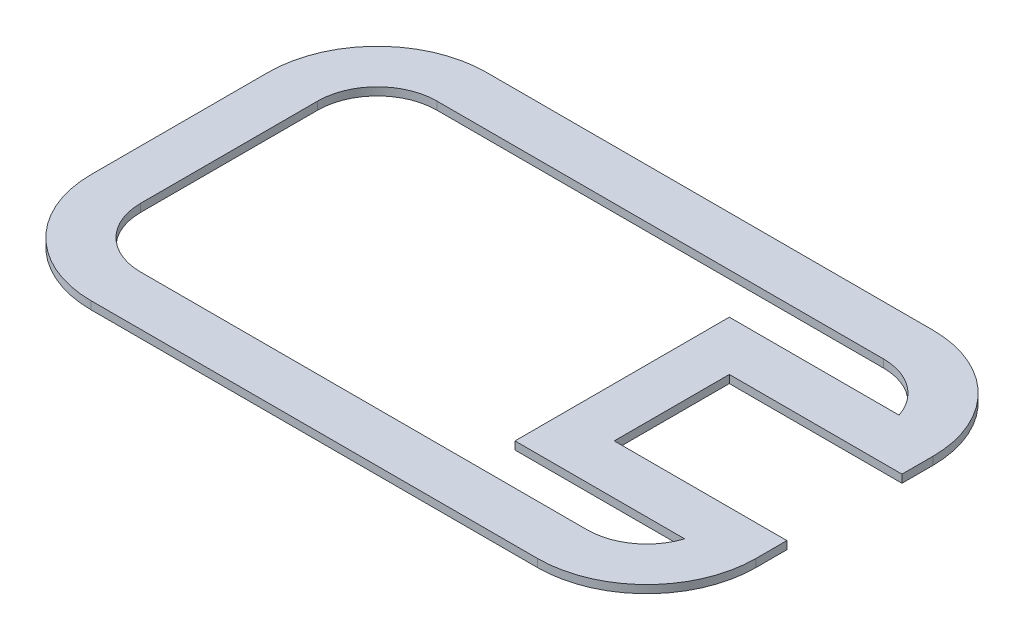
ISO-10303-21;
HEADER;
FILE_DESCRIPTION(('STEP AP214'),'2;1');
FILE_NAME('part.step','',(''),(''),'','','');
FILE_SCHEMA(('AUTOMOTIVE_DESIGN { 1 0 10303 214 1 1 1 1 }'));
ENDSEC;
DATA;
#1=APPLICATION_CONTEXT('core data for automotive mechanical design processes');
#2=APPLICATION_PROTOCOL_DEFINITION('international standard','automotive_design',2000,#1);
#3=PRODUCT_CONTEXT('',#1,'mechanical');
#4=PRODUCT('Part','Part','',(#3));
#5=PRODUCT_RELATED_PRODUCT_CATEGORY('part','',(#4));
#6=PRODUCT_DEFINITION_FORMATION('','',#4);
#7=PRODUCT_DEFINITION_CONTEXT('part definition',#1,'design');
#8=PRODUCT_DEFINITION('design','',#6,#7);
#9=PRODUCT_DEFINITION_SHAPE('','',#8);
#10=(LENGTH_UNIT() NAMED_UNIT(*) SI_UNIT(.MILLI.,.METRE.));
#11=(NAMED_UNIT(*) PLANE_ANGLE_UNIT() SI_UNIT($,.RADIAN.));
#12=(NAMED_UNIT(*) SI_UNIT($,.STERADIAN.) SOLID_ANGLE_UNIT());
#13=UNCERTAINTY_MEASURE_WITH_UNIT(LENGTH_MEASURE(1.E-05),#10,'distance_accuracy_value','');
#14=(GEOMETRIC_REPRESENTATION_CONTEXT(3) GLOBAL_UNCERTAINTY_ASSIGNED_CONTEXT((#13)) GLOBAL_UNIT_ASSIGNED_CONTEXT((#10,
#11,#12)) REPRESENTATION_CONTEXT('',''));
#15=CARTESIAN_POINT('',(0.,0.,0.));
#16=DIRECTION('',(0.,0.,1.));
#17=DIRECTION('',(1.,0.,0.));
#18=AXIS2_PLACEMENT_3D('',#15,#16,#17);
#19=CARTESIAN_POINT('',(1.96231369162959,4.,121.411584964041));
#20=DIRECTION('',(0.,1.,0.));
#21=DIRECTION('',(0.,0.,1.));
#22=AXIS2_PLACEMENT_3D('',#19,#20,#21);
#23=PLANE('',#22);
#24=CARTESIAN_POINT('',(1.96231369162959,4.,121.411584964041));
#25=DIRECTION('',(0.,1.,0.));
#26=DIRECTION('',(0.,0.,1.));
#27=AXIS2_PLACEMENT_3D('',#24,#25,#26);
#28=CIRCLE('',#27,55.);
#29=CARTESIAN_POINT('',(-53.0376863083704,4.,121.411584964041));
#30=VERTEX_POINT('',#29);
#31=CARTESIAN_POINT('',(1.96231369162998,4.,176.411584964041));
#32=VERTEX_POINT('',#31);
#33=EDGE_CURVE('E261',#30,#32,#28,.T.);
#34=ORIENTED_EDGE('',*,*,#33,.T.);
#35=DIRECTION('',(1.,0.,0.));
#36=VECTOR('',#35,1.);
#37=CARTESIAN_POINT('',(1.96231369162998,4.,176.411584964041));
#38=LINE('',#37,#36);
#39=CARTESIAN_POINT('',(226.992313691629,4.,176.411584964041));
#40=VERTEX_POINT('',#39);
#41=EDGE_CURVE('E264',#32,#40,#38,.T.);
#42=ORIENTED_EDGE('',*,*,#41,.T.);
#43=CARTESIAN_POINT('',(226.99231369163,4.,121.411584964041));
#44=DIRECTION('',(0.,1.,0.));
#45=DIRECTION('',(0.,0.,1.));
#46=AXIS2_PLACEMENT_3D('',#43,#44,#45);
#47=CIRCLE('',#46,55.);
#48=CARTESIAN_POINT('',(281.99231369163,4.,121.411584964041));
#49=VERTEX_POINT('',#48);
#50=EDGE_CURVE('E267',#40,#49,#47,.T.);
#51=ORIENTED_EDGE('',*,*,#50,.T.);
#52=DIRECTION('',(0.,0.,-1.));
#53=VECTOR('',#52,1.);
#54=CARTESIAN_POINT('',(281.99231369163,4.,105.781584964041));
#55=LINE('',#54,#53);
#56=CARTESIAN_POINT('',(281.99231369163,4.,105.781584964041));
#57=VERTEX_POINT('',#56);
#58=EDGE_CURVE('E269',#49,#57,#55,.T.);
#59=ORIENTED_EDGE('',*,*,#58,.T.);
#60=DIRECTION('',(-1.,0.,0.));
#61=VECTOR('',#60,1.);
#62=CARTESIAN_POINT('',(194.99231369163,4.,105.781584964041));
#63=LINE('',#62,#61);
#64=CARTESIAN_POINT('',(194.99231369163,4.,105.781584964041));
#65=VERTEX_POINT('',#64);
#66=EDGE_CURVE('E271',#57,#65,#63,.T.);
#67=ORIENTED_EDGE('',*,*,#66,.T.);
#68=DIRECTION('',(0.,0.,-1.));
#69=VECTOR('',#68,1.);
#70=CARTESIAN_POINT('',(194.99231369163,4.,47.7815849640411));
#71=LINE('',#70,#69);
#72=CARTESIAN_POINT('',(194.99231369163,4.,47.7815849640411));
#73=VERTEX_POINT('',#72);
#74=EDGE_CURVE('E273',#65,#73,#71,.T.);
#75=ORIENTED_EDGE('',*,*,#74,.T.);
#76=DIRECTION('',(1.,0.,0.));
#77=VECTOR('',#76,1.);
#78=CARTESIAN_POINT('',(194.99231369163,4.,47.7815849640411));
#79=LINE('',#78,#77);
#80=CARTESIAN_POINT('',(281.99231369163,4.,47.7815849640411));
#81=VERTEX_POINT('',#80);
#82=EDGE_CURVE('E275',#73,#81,#79,.T.);
#83=ORIENTED_EDGE('',*,*,#82,.T.);
#84=DIRECTION('',(0.,0.,-1.));
#85=VECTOR('',#84,1.);
#86=CARTESIAN_POINT('',(281.99231369163,4.,32.1515849640415));
#87=LINE('',#86,#85);
#88=CARTESIAN_POINT('',(281.99231369163,4.,32.1515849640415));
#89=VERTEX_POINT('',#88);
#90=EDGE_CURVE('E277',#81,#89,#87,.T.);
#91=ORIENTED_EDGE('',*,*,#90,.T.);
#92=CARTESIAN_POINT('',(226.99231369163,4.,32.1515849640411));
#93=DIRECTION('',(0.,1.,0.));
#94=DIRECTION('',(0.,0.,-1.));
#95=AXIS2_PLACEMENT_3D('',#92,#93,#94);
#96=CIRCLE('',#95,55.);
#97=CARTESIAN_POINT('',(226.992313691629,4.,-22.8484150359589));
#98=VERTEX_POINT('',#97);
#99=EDGE_CURVE('E279',#89,#98,#96,.T.);
#100=ORIENTED_EDGE('',*,*,#99,.T.);
#101=DIRECTION('',(-1.,0.,0.));
#102=VECTOR('',#101,1.);
#103=CARTESIAN_POINT('',(1.96231369162995,4.,-22.8484150359589));
#104=LINE('',#103,#102);
#105=CARTESIAN_POINT('',(1.96231369162994,4.,-22.8484150359589));
#106=VERTEX_POINT('',#105);
#107=EDGE_CURVE('E281',#98,#106,#104,.T.);
#108=ORIENTED_EDGE('',*,*,#107,.T.);
#109=CARTESIAN_POINT('',(1.96231369162957,4.,32.1515849640411));
#110=DIRECTION('',(0.,1.,0.));
#111=DIRECTION('',(0.,0.,1.));
#112=AXIS2_PLACEMENT_3D('',#109,#110,#111);
#113=CIRCLE('',#112,55.);
#114=CARTESIAN_POINT('',(-53.0376863083704,4.,32.1515849640415));
#115=VERTEX_POINT('',#114);
#116=EDGE_CURVE('E283',#106,#115,#113,.T.);
#117=ORIENTED_EDGE('',*,*,#116,.T.);
#118=DIRECTION('',(0.,0.,1.));
#119=VECTOR('',#118,1.);
#120=CARTESIAN_POINT('',(-53.0376863083704,4.,32.1515849640415));
#121=LINE('',#120,#119);
#122=EDGE_CURVE('E285',#115,#30,#121,.T.);
#123=ORIENTED_EDGE('',*,*,#122,.T.);
#124=EDGE_LOOP('',(#34,#42,#51,#59,#67,#75,#83,#91,#100,#108,#117,#123));
#125=FACE_BOUND('',#124,.T.);
#126=DIRECTION('',(0.,0.,-1.));
#127=VECTOR('',#126,1.);
#128=CARTESIAN_POINT('',(169.99231369163,4.,22.7815849640411));
#129=LINE('',#128,#127);
#130=CARTESIAN_POINT('',(169.99231369163,4.,130.781584964041));
#131=VERTEX_POINT('',#130);
#132=CARTESIAN_POINT('',(169.99231369163,4.,22.7815849640411));
#133=VERTEX_POINT('',#132);
#134=EDGE_CURVE('E190',#131,#133,#129,.T.);
#135=ORIENTED_EDGE('',*,*,#134,.F.);
#136=DIRECTION('',(-1.,0.,0.));
#137=VECTOR('',#136,1.);
#138=CARTESIAN_POINT('',(169.99231369163,4.,130.781584964041));
#139=LINE('',#138,#137);
#140=CARTESIAN_POINT('',(255.491490872734,4.,130.781584964041));
#141=VERTEX_POINT('',#140);
#142=EDGE_CURVE('E182',#141,#131,#139,.T.);
#143=ORIENTED_EDGE('',*,*,#142,.F.);
#144=CARTESIAN_POINT('',(226.99231369163,4.,121.411584964041));
#145=DIRECTION('',(0.,1.,0.));
#146=DIRECTION('',(0.,0.,1.));
#147=AXIS2_PLACEMENT_3D('',#144,#145,#146);
#148=CIRCLE('',#147,30.);
#149=CARTESIAN_POINT('',(226.99231369163,4.,151.411584964041));
#150=VERTEX_POINT('',#149);
#151=EDGE_CURVE('E219',#150,#141,#148,.T.);
#152=ORIENTED_EDGE('',*,*,#151,.F.);
#153=DIRECTION('',(1.,0.,0.));
#154=VECTOR('',#153,1.);
#155=CARTESIAN_POINT('',(1.96231369162998,4.,151.411584964041));
#156=LINE('',#155,#154);
#157=CARTESIAN_POINT('',(1.96231369162998,4.,151.411584964041));
#158=VERTEX_POINT('',#157);
#159=EDGE_CURVE('E217',#158,#150,#156,.T.);
#160=ORIENTED_EDGE('',*,*,#159,.F.);
#161=CARTESIAN_POINT('',(1.96231369162959,4.,121.411584964041));
#162=DIRECTION('',(0.,1.,0.));
#163=DIRECTION('',(0.,0.,1.));
#164=AXIS2_PLACEMENT_3D('',#161,#162,#163);
#165=CIRCLE('',#164,30.);
#166=CARTESIAN_POINT('',(-28.0376863083704,4.,121.411584964041));
#167=VERTEX_POINT('',#166);
#168=EDGE_CURVE('E215',#167,#158,#165,.T.);
#169=ORIENTED_EDGE('',*,*,#168,.F.);
#170=DIRECTION('',(0.,0.,1.));
#171=VECTOR('',#170,1.);
#172=CARTESIAN_POINT('',(-28.0376863083704,4.,32.1515849640415));
#173=LINE('',#172,#171);
#174=CARTESIAN_POINT('',(-28.0376863083704,4.,32.1515849640415));
#175=VERTEX_POINT('',#174);
#176=EDGE_CURVE('E213',#175,#167,#173,.T.);
#177=ORIENTED_EDGE('',*,*,#176,.F.);
#178=CARTESIAN_POINT('',(1.96231369162957,4.,32.1515849640411));
#179=DIRECTION('',(0.,1.,0.));
#180=DIRECTION('',(0.,0.,1.));
#181=AXIS2_PLACEMENT_3D('',#178,#179,#180);
#182=CIRCLE('',#181,30.);
#183=CARTESIAN_POINT('',(1.96231369162977,4.,2.1515849640411));
#184=VERTEX_POINT('',#183);
#185=EDGE_CURVE('E211',#184,#175,#182,.T.);
#186=ORIENTED_EDGE('',*,*,#185,.F.);
#187=DIRECTION('',(-1.,0.,0.));
#188=VECTOR('',#187,1.);
#189=CARTESIAN_POINT('',(1.96231369162977,4.,2.1515849640411));
#190=LINE('',#189,#188);
#191=CARTESIAN_POINT('',(226.992313691629,4.,2.1515849640411));
#192=VERTEX_POINT('',#191);
#193=EDGE_CURVE('E209',#192,#184,#190,.T.);
#194=ORIENTED_EDGE('',*,*,#193,.F.);
#195=CARTESIAN_POINT('',(226.99231369163,4.,32.1515849640411));
#196=DIRECTION('',(0.,1.,0.));
#197=DIRECTION('',(0.,0.,-1.));
#198=AXIS2_PLACEMENT_3D('',#195,#196,#197);
#199=CIRCLE('',#198,30.);
#200=CARTESIAN_POINT('',(255.491490872734,4.,22.7815849640411));
#201=VERTEX_POINT('',#200);
#202=EDGE_CURVE('E205',#201,#192,#199,.T.);
#203=ORIENTED_EDGE('',*,*,#202,.F.);
#204=DIRECTION('',(1.,0.,0.));
#205=VECTOR('',#204,1.);
#206=CARTESIAN_POINT('',(169.99231369163,4.,22.7815849640411));
#207=LINE('',#206,#205);
#208=EDGE_CURVE('E203',#133,#201,#207,.T.);
#209=ORIENTED_EDGE('',*,*,#208,.F.);
#210=EDGE_LOOP('',(#135,#143,#152,#160,#169,#177,#186,#194,#203,#209));
#211=FACE_BOUND('',#210,.T.);
#212=ADVANCED_FACE('F33',(#125,#211),#23,.T.);
#213=CARTESIAN_POINT('',(1.96231369162959,0.,121.411584964041));
#214=DIRECTION('',(0.,1.,0.));
#215=DIRECTION('',(0.,0.,1.));
#216=AXIS2_PLACEMENT_3D('',#213,#214,#215);
#217=PLANE('',#216);
#218=CARTESIAN_POINT('',(1.96231369162959,0.,121.411584964041));
#219=DIRECTION('',(0.,1.,0.));
#220=DIRECTION('',(0.,0.,1.));
#221=AXIS2_PLACEMENT_3D('',#218,#219,#220);
#222=CIRCLE('',#221,55.);
#223=CARTESIAN_POINT('',(-53.0376863083704,0.,121.411584964041));
#224=VERTEX_POINT('',#223);
#225=CARTESIAN_POINT('',(1.96231369162998,0.,176.411584964041));
#226=VERTEX_POINT('',#225);
#227=EDGE_CURVE('E198',#224,#226,#222,.T.);
#228=ORIENTED_EDGE('',*,*,#227,.F.);
#229=DIRECTION('',(0.,0.,1.));
#230=VECTOR('',#229,1.);
#231=CARTESIAN_POINT('',(-53.0376863083704,0.,32.1515849640415));
#232=LINE('',#231,#230);
#233=CARTESIAN_POINT('',(-53.0376863083704,0.,32.1515849640415));
#234=VERTEX_POINT('',#233);
#235=EDGE_CURVE('E265',#234,#224,#232,.T.);
#236=ORIENTED_EDGE('',*,*,#235,.F.);
#237=CARTESIAN_POINT('',(1.96231369162957,0.,32.1515849640411));
#238=DIRECTION('',(0.,1.,0.));
#239=DIRECTION('',(0.,0.,1.));
#240=AXIS2_PLACEMENT_3D('',#237,#238,#239);
#241=CIRCLE('',#240,55.);
#242=CARTESIAN_POINT('',(1.96231369162994,0.,-22.8484150359589));
#243=VERTEX_POINT('',#242);
#244=EDGE_CURVE('E308',#243,#234,#241,.T.);
#245=ORIENTED_EDGE('',*,*,#244,.F.);
#246=DIRECTION('',(-1.,0.,0.));
#247=VECTOR('',#246,1.);
#248=CARTESIAN_POINT('',(1.96231369162995,0.,-22.8484150359589));
#249=LINE('',#248,#247);
#250=CARTESIAN_POINT('',(226.992313691629,0.,-22.8484150359589));
#251=VERTEX_POINT('',#250);
#252=EDGE_CURVE('E306',#251,#243,#249,.T.);
#253=ORIENTED_EDGE('',*,*,#252,.F.);
#254=CARTESIAN_POINT('',(226.99231369163,0.,32.1515849640411));
#255=DIRECTION('',(0.,1.,0.));
#256=DIRECTION('',(0.,0.,-1.));
#257=AXIS2_PLACEMENT_3D('',#254,#255,#256);
#258=CIRCLE('',#257,55.);
#259=CARTESIAN_POINT('',(281.99231369163,0.,32.1515849640415));
#260=VERTEX_POINT('',#259);
#261=EDGE_CURVE('E304',#260,#251,#258,.T.);
#262=ORIENTED_EDGE('',*,*,#261,.F.);
#263=DIRECTION('',(0.,0.,-1.));
#264=VECTOR('',#263,1.);
#265=CARTESIAN_POINT('',(281.99231369163,0.,32.1515849640415));
#266=LINE('',#265,#264);
#267=CARTESIAN_POINT('',(281.99231369163,0.,47.7815849640411));
#268=VERTEX_POINT('',#267);
#269=EDGE_CURVE('E302',#268,#260,#266,.T.);
#270=ORIENTED_EDGE('',*,*,#269,.F.);
#271=DIRECTION('',(1.,0.,0.));
#272=VECTOR('',#271,1.);
#273=CARTESIAN_POINT('',(194.99231369163,0.,47.7815849640411));
#274=LINE('',#273,#272);
#275=CARTESIAN_POINT('',(194.99231369163,0.,47.7815849640411));
#276=VERTEX_POINT('',#275);
#277=EDGE_CURVE('E300',#276,#268,#274,.T.);
#278=ORIENTED_EDGE('',*,*,#277,.F.);
#279=DIRECTION('',(0.,0.,-1.));
#280=VECTOR('',#279,1.);
#281=CARTESIAN_POINT('',(194.99231369163,0.,47.7815849640411));
#282=LINE('',#281,#280);
#283=CARTESIAN_POINT('',(194.99231369163,0.,105.781584964041));
#284=VERTEX_POINT('',#283);
#285=EDGE_CURVE('E298',#284,#276,#282,.T.);
#286=ORIENTED_EDGE('',*,*,#285,.F.);
#287=DIRECTION('',(-1.,0.,0.));
#288=VECTOR('',#287,1.);
#289=CARTESIAN_POINT('',(194.99231369163,0.,105.781584964041));
#290=LINE('',#289,#288);
#291=CARTESIAN_POINT('',(281.99231369163,0.,105.781584964041));
#292=VERTEX_POINT('',#291);
#293=EDGE_CURVE('E296',#292,#284,#290,.T.);
#294=ORIENTED_EDGE('',*,*,#293,.F.);
#295=DIRECTION('',(0.,0.,-1.));
#296=VECTOR('',#295,1.);
#297=CARTESIAN_POINT('',(281.99231369163,0.,105.781584964041));
#298=LINE('',#297,#296);
#299=CARTESIAN_POINT('',(281.99231369163,0.,121.411584964041));
#300=VERTEX_POINT('',#299);
#301=EDGE_CURVE('E294',#300,#292,#298,.T.);
#302=ORIENTED_EDGE('',*,*,#301,.F.);
#303=CARTESIAN_POINT('',(226.99231369163,0.,121.411584964041));
#304=DIRECTION('',(0.,1.,0.));
#305=DIRECTION('',(0.,0.,1.));
#306=AXIS2_PLACEMENT_3D('',#303,#304,#305);
#307=CIRCLE('',#306,55.);
#308=CARTESIAN_POINT('',(226.992313691629,0.,176.411584964041));
#309=VERTEX_POINT('',#308);
#310=EDGE_CURVE('E292',#309,#300,#307,.T.);
#311=ORIENTED_EDGE('',*,*,#310,.F.);
#312=DIRECTION('',(1.,0.,0.));
#313=VECTOR('',#312,1.);
#314=CARTESIAN_POINT('',(1.96231369162998,0.,176.411584964041));
#315=LINE('',#314,#313);
#316=EDGE_CURVE('E290',#226,#309,#315,.T.);
#317=ORIENTED_EDGE('',*,*,#316,.F.);
#318=EDGE_LOOP('',(#228,#236,#245,#253,#262,#270,#278,#286,#294,#302,#311,#317));
#319=FACE_BOUND('',#318,.T.);
#320=DIRECTION('',(-1.,0.,0.));
#321=VECTOR('',#320,1.);
#322=CARTESIAN_POINT('',(169.99231369163,0.,130.781584964041));
#323=LINE('',#322,#321);
#324=CARTESIAN_POINT('',(255.491490872734,0.,130.781584964041));
#325=VERTEX_POINT('',#324);
#326=CARTESIAN_POINT('',(169.99231369163,0.,130.781584964041));
#327=VERTEX_POINT('',#326);
#328=EDGE_CURVE('E56',#325,#327,#323,.T.);
#329=ORIENTED_EDGE('',*,*,#328,.T.);
#330=DIRECTION('',(0.,0.,-1.));
#331=VECTOR('',#330,1.);
#332=CARTESIAN_POINT('',(169.99231369163,0.,22.7815849640411));
#333=LINE('',#332,#331);
#334=CARTESIAN_POINT('',(169.99231369163,0.,22.7815849640411));
#335=VERTEX_POINT('',#334);
#336=EDGE_CURVE('E197',#327,#335,#333,.T.);
#337=ORIENTED_EDGE('',*,*,#336,.T.);
#338=DIRECTION('',(1.,0.,0.));
#339=VECTOR('',#338,1.);
#340=CARTESIAN_POINT('',(169.99231369163,0.,22.7815849640411));
#341=LINE('',#340,#339);
#342=CARTESIAN_POINT('',(255.491490872734,0.,22.7815849640411));
#343=VERTEX_POINT('',#342);
#344=EDGE_CURVE('E223',#335,#343,#341,.T.);
#345=ORIENTED_EDGE('',*,*,#344,.T.);
#346=CARTESIAN_POINT('',(226.99231369163,0.,32.1515849640411));
#347=DIRECTION('',(0.,1.,0.));
#348=DIRECTION('',(0.,0.,-1.));
#349=AXIS2_PLACEMENT_3D('',#346,#347,#348);
#350=CIRCLE('',#349,30.);
#351=CARTESIAN_POINT('',(226.992313691629,0.,2.1515849640411));
#352=VERTEX_POINT('',#351);
#353=EDGE_CURVE('E226',#343,#352,#350,.T.);
#354=ORIENTED_EDGE('',*,*,#353,.T.);
#355=DIRECTION('',(-1.,0.,0.));
#356=VECTOR('',#355,1.);
#357=CARTESIAN_POINT('',(1.96231369162977,0.,2.1515849640411));
#358=LINE('',#357,#356);
#359=CARTESIAN_POINT('',(1.96231369162977,0.,2.1515849640411));
#360=VERTEX_POINT('',#359);
#361=EDGE_CURVE('E229',#352,#360,#358,.T.);
#362=ORIENTED_EDGE('',*,*,#361,.T.);
#363=CARTESIAN_POINT('',(1.96231369162957,0.,32.1515849640411));
#364=DIRECTION('',(0.,1.,0.));
#365=DIRECTION('',(0.,0.,1.));
#366=AXIS2_PLACEMENT_3D('',#363,#364,#365);
#367=CIRCLE('',#366,30.);
#368=CARTESIAN_POINT('',(-28.0376863083704,0.,32.1515849640415));
#369=VERTEX_POINT('',#368);
#370=EDGE_CURVE('E232',#360,#369,#367,.T.);
#371=ORIENTED_EDGE('',*,*,#370,.T.);
#372=DIRECTION('',(0.,0.,1.));
#373=VECTOR('',#372,1.);
#374=CARTESIAN_POINT('',(-28.0376863083704,0.,32.1515849640415));
#375=LINE('',#374,#373);
#376=CARTESIAN_POINT('',(-28.0376863083704,0.,121.411584964041));
#377=VERTEX_POINT('',#376);
#378=EDGE_CURVE('E235',#369,#377,#375,.T.);
#379=ORIENTED_EDGE('',*,*,#378,.T.);
#380=CARTESIAN_POINT('',(1.96231369162959,0.,121.411584964041));
#381=DIRECTION('',(0.,1.,0.));
#382=DIRECTION('',(0.,0.,1.));
#383=AXIS2_PLACEMENT_3D('',#380,#381,#382);
#384=CIRCLE('',#383,30.);
#385=CARTESIAN_POINT('',(1.96231369162998,0.,151.411584964041));
#386=VERTEX_POINT('',#385);
#387=EDGE_CURVE('E238',#377,#386,#384,.T.);
#388=ORIENTED_EDGE('',*,*,#387,.T.);
#389=DIRECTION('',(1.,0.,0.));
#390=VECTOR('',#389,1.);
#391=CARTESIAN_POINT('',(1.96231369162998,0.,151.411584964041));
#392=LINE('',#391,#390);
#393=CARTESIAN_POINT('',(226.992313691629,0.,151.411584964041));
#394=VERTEX_POINT('',#393);
#395=EDGE_CURVE('E241',#386,#394,#392,.T.);
#396=ORIENTED_EDGE('',*,*,#395,.T.);
#397=CARTESIAN_POINT('',(226.99231369163,0.,121.411584964041));
#398=DIRECTION('',(0.,1.,0.));
#399=DIRECTION('',(0.,0.,1.));
#400=AXIS2_PLACEMENT_3D('',#397,#398,#399);
#401=CIRCLE('',#400,30.);
#402=EDGE_CURVE('E191',#394,#325,#401,.T.);
#403=ORIENTED_EDGE('',*,*,#402,.T.);
#404=EDGE_LOOP('',(#329,#337,#345,#354,#362,#371,#379,#388,#396,#403));
#405=FACE_BOUND('',#404,.T.);
#406=ADVANCED_FACE('F350',(#319,#405),#217,.F.);
#407=CARTESIAN_POINT('',(1.96231369162959,4.,121.411584964041));
#408=DIRECTION('',(0.,-1.,0.));
#409=DIRECTION('',(0.,0.,-1.));
#410=AXIS2_PLACEMENT_3D('',#407,#408,#409);
#411=CYLINDRICAL_SURFACE('',#410,55.);
#412=ORIENTED_EDGE('',*,*,#227,.T.);
#413=DIRECTION('',(0.,-1.,0.));
#414=VECTOR('',#413,1.);
#415=CARTESIAN_POINT('',(1.96231369162998,4.,176.411584964041));
#416=LINE('',#415,#414);
#417=EDGE_CURVE('E11',#32,#226,#416,.T.);
#418=ORIENTED_EDGE('',*,*,#417,.F.);
#419=ORIENTED_EDGE('',*,*,#33,.F.);
#420=DIRECTION('',(0.,-1.,0.));
#421=VECTOR('',#420,1.);
#422=CARTESIAN_POINT('',(-53.0376863083704,4.,121.411584964041));
#423=LINE('',#422,#421);
#424=EDGE_CURVE('E287',#30,#224,#423,.T.);
#425=ORIENTED_EDGE('',*,*,#424,.T.);
#426=EDGE_LOOP('',(#412,#418,#419,#425));
#427=FACE_BOUND('',#426,.T.);
#428=ADVANCED_FACE('F35',(#427),#411,.T.);
#429=CARTESIAN_POINT('',(1.96231369162998,4.,176.411584964041));
#430=DIRECTION('',(0.,0.,-1.));
#431=DIRECTION('',(-1.,0.,0.));
#432=AXIS2_PLACEMENT_3D('',#429,#430,#431);
#433=PLANE('',#432);
#434=ORIENTED_EDGE('',*,*,#316,.T.);
#435=DIRECTION('',(0.,-1.,0.));
#436=VECTOR('',#435,1.);
#437=CARTESIAN_POINT('',(226.992313691629,4.,176.411584964041));
#438=LINE('',#437,#436);
#439=EDGE_CURVE('E41',#40,#309,#438,.T.);
#440=ORIENTED_EDGE('',*,*,#439,.F.);
#441=ORIENTED_EDGE('',*,*,#41,.F.);
#442=ORIENTED_EDGE('',*,*,#417,.T.);
#443=EDGE_LOOP('',(#434,#440,#441,#442));
#444=FACE_BOUND('',#443,.T.);
#445=ADVANCED_FACE('F367',(#444),#433,.F.);
#446=CARTESIAN_POINT('',(226.99231369163,4.,121.411584964041));
#447=DIRECTION('',(0.,-1.,0.));
#448=DIRECTION('',(0.,0.,-1.));
#449=AXIS2_PLACEMENT_3D('',#446,#447,#448);
#450=CYLINDRICAL_SURFACE('',#449,55.);
#451=ORIENTED_EDGE('',*,*,#310,.T.);
#452=DIRECTION('',(0.,-1.,0.));
#453=VECTOR('',#452,1.);
#454=CARTESIAN_POINT('',(281.99231369163,4.,121.411584964041));
#455=LINE('',#454,#453);
#456=EDGE_CURVE('E337',#49,#300,#455,.T.);
#457=ORIENTED_EDGE('',*,*,#456,.F.);
#458=ORIENTED_EDGE('',*,*,#50,.F.);
#459=ORIENTED_EDGE('',*,*,#439,.T.);
#460=EDGE_LOOP('',(#451,#457,#458,#459));
#461=FACE_BOUND('',#460,.T.);
#462=ADVANCED_FACE('F344',(#461),#450,.T.);
#463=CARTESIAN_POINT('',(281.99231369163,4.,105.781584964041));
#464=DIRECTION('',(-1.,0.,0.));
#465=DIRECTION('',(0.,0.,1.));
#466=AXIS2_PLACEMENT_3D('',#463,#464,#465);
#467=PLANE('',#466);
#468=ORIENTED_EDGE('',*,*,#301,.T.);
#469=DIRECTION('',(0.,-1.,0.));
#470=VECTOR('',#469,1.);
#471=CARTESIAN_POINT('',(281.99231369163,4.,105.781584964041));
#472=LINE('',#471,#470);
#473=EDGE_CURVE('E334',#57,#292,#472,.T.);
#474=ORIENTED_EDGE('',*,*,#473,.F.);
#475=ORIENTED_EDGE('',*,*,#58,.F.);
#476=ORIENTED_EDGE('',*,*,#456,.T.);
#477=EDGE_LOOP('',(#468,#474,#475,#476));
#478=FACE_BOUND('',#477,.T.);
#479=ADVANCED_FACE('F356',(#478),#467,.F.);
#480=CARTESIAN_POINT('',(194.99231369163,4.,105.781584964041));
#481=DIRECTION('',(0.,0.,1.));
#482=DIRECTION('',(1.,0.,0.));
#483=AXIS2_PLACEMENT_3D('',#480,#481,#482);
#484=PLANE('',#483);
#485=ORIENTED_EDGE('',*,*,#293,.T.);
#486=DIRECTION('',(0.,-1.,0.));
#487=VECTOR('',#486,1.);
#488=CARTESIAN_POINT('',(194.99231369163,4.,105.781584964041));
#489=LINE('',#488,#487);
#490=EDGE_CURVE('E331',#65,#284,#489,.T.);
#491=ORIENTED_EDGE('',*,*,#490,.F.);
#492=ORIENTED_EDGE('',*,*,#66,.F.);
#493=ORIENTED_EDGE('',*,*,#473,.T.);
#494=EDGE_LOOP('',(#485,#491,#492,#493));
#495=FACE_BOUND('',#494,.T.);
#496=ADVANCED_FACE('F360',(#495),#484,.F.);
#497=CARTESIAN_POINT('',(194.99231369163,4.,47.7815849640411));
#498=DIRECTION('',(-1.,0.,0.));
#499=DIRECTION('',(0.,0.,1.));
#500=AXIS2_PLACEMENT_3D('',#497,#498,#499);
#501=PLANE('',#500);
#502=ORIENTED_EDGE('',*,*,#285,.T.);
#503=DIRECTION('',(0.,-1.,0.));
#504=VECTOR('',#503,1.);
#505=CARTESIAN_POINT('',(194.99231369163,4.,47.7815849640411));
#506=LINE('',#505,#504);
#507=EDGE_CURVE('E328',#73,#276,#506,.T.);
#508=ORIENTED_EDGE('',*,*,#507,.F.);
#509=ORIENTED_EDGE('',*,*,#74,.F.);
#510=ORIENTED_EDGE('',*,*,#490,.T.);
#511=EDGE_LOOP('',(#502,#508,#509,#510));
#512=FACE_BOUND('',#511,.T.);
#513=ADVANCED_FACE('F400',(#512),#501,.F.);
#514=CARTESIAN_POINT('',(194.99231369163,4.,47.7815849640411));
#515=DIRECTION('',(0.,0.,-1.));
#516=DIRECTION('',(-1.,0.,0.));
#517=AXIS2_PLACEMENT_3D('',#514,#515,#516);
#518=PLANE('',#517);
#519=ORIENTED_EDGE('',*,*,#277,.T.);
#520=DIRECTION('',(0.,-1.,0.));
#521=VECTOR('',#520,1.);
#522=CARTESIAN_POINT('',(281.99231369163,4.,47.7815849640411));
#523=LINE('',#522,#521);
#524=EDGE_CURVE('E325',#81,#268,#523,.T.);
#525=ORIENTED_EDGE('',*,*,#524,.F.);
#526=ORIENTED_EDGE('',*,*,#82,.F.);
#527=ORIENTED_EDGE('',*,*,#507,.T.);
#528=EDGE_LOOP('',(#519,#525,#526,#527));
#529=FACE_BOUND('',#528,.T.);
#530=ADVANCED_FACE('F398',(#529),#518,.F.);
#531=CARTESIAN_POINT('',(281.99231369163,4.,32.1515849640415));
#532=DIRECTION('',(-1.,0.,0.));
#533=DIRECTION('',(0.,0.,1.));
#534=AXIS2_PLACEMENT_3D('',#531,#532,#533);
#535=PLANE('',#534);
#536=ORIENTED_EDGE('',*,*,#269,.T.);
#537=DIRECTION('',(0.,-1.,0.));
#538=VECTOR('',#537,1.);
#539=CARTESIAN_POINT('',(281.99231369163,4.,32.1515849640415));
#540=LINE('',#539,#538);
#541=EDGE_CURVE('E322',#89,#260,#540,.T.);
#542=ORIENTED_EDGE('',*,*,#541,.F.);
#543=ORIENTED_EDGE('',*,*,#90,.F.);
#544=ORIENTED_EDGE('',*,*,#524,.T.);
#545=EDGE_LOOP('',(#536,#542,#543,#544));
#546=FACE_BOUND('',#545,.T.);
#547=ADVANCED_FACE('F394',(#546),#535,.F.);
#548=CARTESIAN_POINT('',(226.99231369163,4.,32.1515849640411));
#549=DIRECTION('',(0.,-1.,0.));
#550=DIRECTION('',(0.,0.,-1.));
#551=AXIS2_PLACEMENT_3D('',#548,#549,#550);
#552=CYLINDRICAL_SURFACE('',#551,55.);
#553=ORIENTED_EDGE('',*,*,#261,.T.);
#554=DIRECTION('',(0.,-1.,0.));
#555=VECTOR('',#554,1.);
#556=CARTESIAN_POINT('',(226.992313691629,4.,-22.8484150359589));
#557=LINE('',#556,#555);
#558=EDGE_CURVE('E319',#98,#251,#557,.T.);
#559=ORIENTED_EDGE('',*,*,#558,.F.);
#560=ORIENTED_EDGE('',*,*,#99,.F.);
#561=ORIENTED_EDGE('',*,*,#541,.T.);
#562=EDGE_LOOP('',(#553,#559,#560,#561));
#563=FACE_BOUND('',#562,.T.);
#564=ADVANCED_FACE('F389',(#563),#552,.T.);
#565=CARTESIAN_POINT('',(1.96231369162995,4.,-22.8484150359589));
#566=DIRECTION('',(0.,0.,1.));
#567=DIRECTION('',(1.,0.,0.));
#568=AXIS2_PLACEMENT_3D('',#565,#566,#567);
#569=PLANE('',#568);
#570=ORIENTED_EDGE('',*,*,#252,.T.);
#571=DIRECTION('',(0.,-1.,0.));
#572=VECTOR('',#571,1.);
#573=CARTESIAN_POINT('',(1.96231369162994,4.,-22.8484150359589));
#574=LINE('',#573,#572);
#575=EDGE_CURVE('E316',#106,#243,#574,.T.);
#576=ORIENTED_EDGE('',*,*,#575,.F.);
#577=ORIENTED_EDGE('',*,*,#107,.F.);
#578=ORIENTED_EDGE('',*,*,#558,.T.);
#579=EDGE_LOOP('',(#570,#576,#577,#578));
#580=FACE_BOUND('',#579,.T.);
#581=ADVANCED_FACE('F383',(#580),#569,.F.);
#582=CARTESIAN_POINT('',(1.96231369162957,4.,32.1515849640411));
#583=DIRECTION('',(0.,-1.,0.));
#584=DIRECTION('',(0.,0.,-1.));
#585=AXIS2_PLACEMENT_3D('',#582,#583,#584);
#586=CYLINDRICAL_SURFACE('',#585,55.);
#587=ORIENTED_EDGE('',*,*,#244,.T.);
#588=DIRECTION('',(0.,-1.,0.));
#589=VECTOR('',#588,1.);
#590=CARTESIAN_POINT('',(-53.0376863083704,4.,32.1515849640415));
#591=LINE('',#590,#589);
#592=EDGE_CURVE('E313',#115,#234,#591,.T.);
#593=ORIENTED_EDGE('',*,*,#592,.F.);
#594=ORIENTED_EDGE('',*,*,#116,.F.);
#595=ORIENTED_EDGE('',*,*,#575,.T.);
#596=EDGE_LOOP('',(#587,#593,#594,#595));
#597=FACE_BOUND('',#596,.T.);
#598=ADVANCED_FACE('F379',(#597),#586,.T.);
#599=CARTESIAN_POINT('',(-53.0376863083704,4.,32.1515849640415));
#600=DIRECTION('',(1.,0.,0.));
#601=DIRECTION('',(0.,0.,-1.));
#602=AXIS2_PLACEMENT_3D('',#599,#600,#601);
#603=PLANE('',#602);
#604=ORIENTED_EDGE('',*,*,#235,.T.);
#605=ORIENTED_EDGE('',*,*,#424,.F.);
#606=ORIENTED_EDGE('',*,*,#122,.F.);
#607=ORIENTED_EDGE('',*,*,#592,.T.);
#608=EDGE_LOOP('',(#604,#605,#606,#607));
#609=FACE_BOUND('',#608,.T.);
#610=ADVANCED_FACE('F374',(#609),#603,.F.);
#611=CARTESIAN_POINT('',(169.99231369163,4.,130.781584964041));
#612=DIRECTION('',(0.,0.,1.));
#613=DIRECTION('',(1.,0.,0.));
#614=AXIS2_PLACEMENT_3D('',#611,#612,#613);
#615=PLANE('',#614);
#616=ORIENTED_EDGE('',*,*,#328,.F.);
#617=DIRECTION('',(0.,-1.,0.));
#618=VECTOR('',#617,1.);
#619=CARTESIAN_POINT('',(255.491490872734,4.,130.781584964041));
#620=LINE('',#619,#618);
#621=EDGE_CURVE('E186',#141,#325,#620,.T.);
#622=ORIENTED_EDGE('',*,*,#621,.F.);
#623=ORIENTED_EDGE('',*,*,#142,.T.);
#624=DIRECTION('',(0.,-1.,0.));
#625=VECTOR('',#624,1.);
#626=CARTESIAN_POINT('',(169.99231369163,4.,130.781584964041));
#627=LINE('',#626,#625);
#628=EDGE_CURVE('E185',#131,#327,#627,.T.);
#629=ORIENTED_EDGE('',*,*,#628,.T.);
#630=EDGE_LOOP('',(#616,#622,#623,#629));
#631=FACE_BOUND('',#630,.T.);
#632=ADVANCED_FACE('F184',(#631),#615,.T.);
#633=CARTESIAN_POINT('',(169.99231369163,4.,22.7815849640411));
#634=DIRECTION('',(-1.,0.,0.));
#635=DIRECTION('',(0.,0.,1.));
#636=AXIS2_PLACEMENT_3D('',#633,#634,#635);
#637=PLANE('',#636);
#638=ORIENTED_EDGE('',*,*,#336,.F.);
#639=ORIENTED_EDGE('',*,*,#628,.F.);
#640=ORIENTED_EDGE('',*,*,#134,.T.);
#641=DIRECTION('',(0.,-1.,0.));
#642=VECTOR('',#641,1.);
#643=CARTESIAN_POINT('',(169.99231369163,4.,22.7815849640411));
#644=LINE('',#643,#642);
#645=EDGE_CURVE('E199',#133,#335,#644,.T.);
#646=ORIENTED_EDGE('',*,*,#645,.T.);
#647=EDGE_LOOP('',(#638,#639,#640,#646));
#648=FACE_BOUND('',#647,.T.);
#649=ADVANCED_FACE('F194',(#648),#637,.T.);
#650=CARTESIAN_POINT('',(169.99231369163,4.,22.7815849640411));
#651=DIRECTION('',(0.,0.,-1.));
#652=DIRECTION('',(-1.,0.,0.));
#653=AXIS2_PLACEMENT_3D('',#650,#651,#652);
#654=PLANE('',#653);
#655=ORIENTED_EDGE('',*,*,#344,.F.);
#656=ORIENTED_EDGE('',*,*,#645,.F.);
#657=ORIENTED_EDGE('',*,*,#208,.T.);
#658=DIRECTION('',(0.,-1.,0.));
#659=VECTOR('',#658,1.);
#660=CARTESIAN_POINT('',(255.491490872734,4.,22.7815849640411));
#661=LINE('',#660,#659);
#662=EDGE_CURVE('E258',#201,#343,#661,.T.);
#663=ORIENTED_EDGE('',*,*,#662,.T.);
#664=EDGE_LOOP('',(#655,#656,#657,#663));
#665=FACE_BOUND('',#664,.T.);
#666=ADVANCED_FACE('F458',(#665),#654,.T.);
#667=CARTESIAN_POINT('',(226.99231369163,4.,32.1515849640411));
#668=DIRECTION('',(0.,-1.,0.));
#669=DIRECTION('',(0.,0.,-1.));
#670=AXIS2_PLACEMENT_3D('',#667,#668,#669);
#671=CYLINDRICAL_SURFACE('',#670,30.);
#672=ORIENTED_EDGE('',*,*,#353,.F.);
#673=ORIENTED_EDGE('',*,*,#662,.F.);
#674=ORIENTED_EDGE('',*,*,#202,.T.);
#675=DIRECTION('',(0.,-1.,0.));
#676=VECTOR('',#675,1.);
#677=CARTESIAN_POINT('',(226.992313691629,4.,2.1515849640411));
#678=LINE('',#677,#676);
#679=EDGE_CURVE('E256',#192,#352,#678,.T.);
#680=ORIENTED_EDGE('',*,*,#679,.T.);
#681=EDGE_LOOP('',(#672,#673,#674,#680));
#682=FACE_BOUND('',#681,.T.);
#683=ADVANCED_FACE('F464',(#682),#671,.F.);
#684=CARTESIAN_POINT('',(1.96231369162977,4.,2.1515849640411));
#685=DIRECTION('',(0.,0.,1.));
#686=DIRECTION('',(1.,0.,0.));
#687=AXIS2_PLACEMENT_3D('',#684,#685,#686);
#688=PLANE('',#687);
#689=ORIENTED_EDGE('',*,*,#361,.F.);
#690=ORIENTED_EDGE('',*,*,#679,.F.);
#691=ORIENTED_EDGE('',*,*,#193,.T.);
#692=DIRECTION('',(0.,-1.,0.));
#693=VECTOR('',#692,1.);
#694=CARTESIAN_POINT('',(1.96231369162977,4.,2.1515849640411));
#695=LINE('',#694,#693);
#696=EDGE_CURVE('E254',#184,#360,#695,.T.);
#697=ORIENTED_EDGE('',*,*,#696,.T.);
#698=EDGE_LOOP('',(#689,#690,#691,#697));
#699=FACE_BOUND('',#698,.T.);
#700=ADVANCED_FACE('F472',(#699),#688,.T.);
#701=CARTESIAN_POINT('',(1.96231369162957,4.,32.1515849640411));
#702=DIRECTION('',(0.,-1.,0.));
#703=DIRECTION('',(0.,0.,-1.));
#704=AXIS2_PLACEMENT_3D('',#701,#702,#703);
#705=CYLINDRICAL_SURFACE('',#704,30.);
#706=ORIENTED_EDGE('',*,*,#370,.F.);
#707=ORIENTED_EDGE('',*,*,#696,.F.);
#708=ORIENTED_EDGE('',*,*,#185,.T.);
#709=DIRECTION('',(0.,-1.,0.));
#710=VECTOR('',#709,1.);
#711=CARTESIAN_POINT('',(-28.0376863083704,4.,32.1515849640415));
#712=LINE('',#711,#710);
#713=EDGE_CURVE('E252',#175,#369,#712,.T.);
#714=ORIENTED_EDGE('',*,*,#713,.T.);
#715=EDGE_LOOP('',(#706,#707,#708,#714));
#716=FACE_BOUND('',#715,.T.);
#717=ADVANCED_FACE('F480',(#716),#705,.F.);
#718=CARTESIAN_POINT('',(-28.0376863083704,4.,32.1515849640415));
#719=DIRECTION('',(1.,0.,0.));
#720=DIRECTION('',(0.,0.,-1.));
#721=AXIS2_PLACEMENT_3D('',#718,#719,#720);
#722=PLANE('',#721);
#723=ORIENTED_EDGE('',*,*,#378,.F.);
#724=ORIENTED_EDGE('',*,*,#713,.F.);
#725=ORIENTED_EDGE('',*,*,#176,.T.);
#726=DIRECTION('',(0.,-1.,0.));
#727=VECTOR('',#726,1.);
#728=CARTESIAN_POINT('',(-28.0376863083704,4.,121.411584964041));
#729=LINE('',#728,#727);
#730=EDGE_CURVE('E250',#167,#377,#729,.T.);
#731=ORIENTED_EDGE('',*,*,#730,.T.);
#732=EDGE_LOOP('',(#723,#724,#725,#731));
#733=FACE_BOUND('',#732,.T.);
#734=ADVANCED_FACE('F488',(#733),#722,.T.);
#735=CARTESIAN_POINT('',(1.96231369162959,4.,121.411584964041));
#736=DIRECTION('',(0.,-1.,0.));
#737=DIRECTION('',(0.,0.,-1.));
#738=AXIS2_PLACEMENT_3D('',#735,#736,#737);
#739=CYLINDRICAL_SURFACE('',#738,30.);
#740=ORIENTED_EDGE('',*,*,#387,.F.);
#741=ORIENTED_EDGE('',*,*,#730,.F.);
#742=ORIENTED_EDGE('',*,*,#168,.T.);
#743=DIRECTION('',(0.,-1.,0.));
#744=VECTOR('',#743,1.);
#745=CARTESIAN_POINT('',(1.96231369162998,4.,151.411584964041));
#746=LINE('',#745,#744);
#747=EDGE_CURVE('E248',#158,#386,#746,.T.);
#748=ORIENTED_EDGE('',*,*,#747,.T.);
#749=EDGE_LOOP('',(#740,#741,#742,#748));
#750=FACE_BOUND('',#749,.T.);
#751=ADVANCED_FACE('F496',(#750),#739,.F.);
#752=CARTESIAN_POINT('',(1.96231369162998,4.,151.411584964041));
#753=DIRECTION('',(0.,0.,-1.));
#754=DIRECTION('',(-1.,0.,0.));
#755=AXIS2_PLACEMENT_3D('',#752,#753,#754);
#756=PLANE('',#755);
#757=ORIENTED_EDGE('',*,*,#395,.F.);
#758=ORIENTED_EDGE('',*,*,#747,.F.);
#759=ORIENTED_EDGE('',*,*,#159,.T.);
#760=DIRECTION('',(0.,-1.,0.));
#761=VECTOR('',#760,1.);
#762=CARTESIAN_POINT('',(226.992313691629,4.,151.411584964041));
#763=LINE('',#762,#761);
#764=EDGE_CURVE('E48',#150,#394,#763,.T.);
#765=ORIENTED_EDGE('',*,*,#764,.T.);
#766=EDGE_LOOP('',(#757,#758,#759,#765));
#767=FACE_BOUND('',#766,.T.);
#768=ADVANCED_FACE('F504',(#767),#756,.T.);
#769=CARTESIAN_POINT('',(226.99231369163,4.,121.411584964041));
#770=DIRECTION('',(0.,-1.,0.));
#771=DIRECTION('',(0.,0.,-1.));
#772=AXIS2_PLACEMENT_3D('',#769,#770,#771);
#773=CYLINDRICAL_SURFACE('',#772,30.);
#774=ORIENTED_EDGE('',*,*,#402,.F.);
#775=ORIENTED_EDGE('',*,*,#764,.F.);
#776=ORIENTED_EDGE('',*,*,#151,.T.);
#777=ORIENTED_EDGE('',*,*,#621,.T.);
#778=EDGE_LOOP('',(#774,#775,#776,#777));
#779=FACE_BOUND('',#778,.T.);
#780=ADVANCED_FACE('F512',(#779),#773,.F.);
#781=CLOSED_SHELL('',(#212,#406,#428,#445,#462,#479,#496,#513,#530,#547,#564,#581,#598,#610,
#632,#649,#666,#683,#700,#717,#734,#751,#768,#780));
#782=MANIFOLD_SOLID_BREP('B2',#781);
#783=ADVANCED_BREP_SHAPE_REPRESENTATION('',(#18,#782),#14);
#784=SHAPE_DEFINITION_REPRESENTATION(#9,#783);
ENDSEC;
END-ISO-10303-21;
